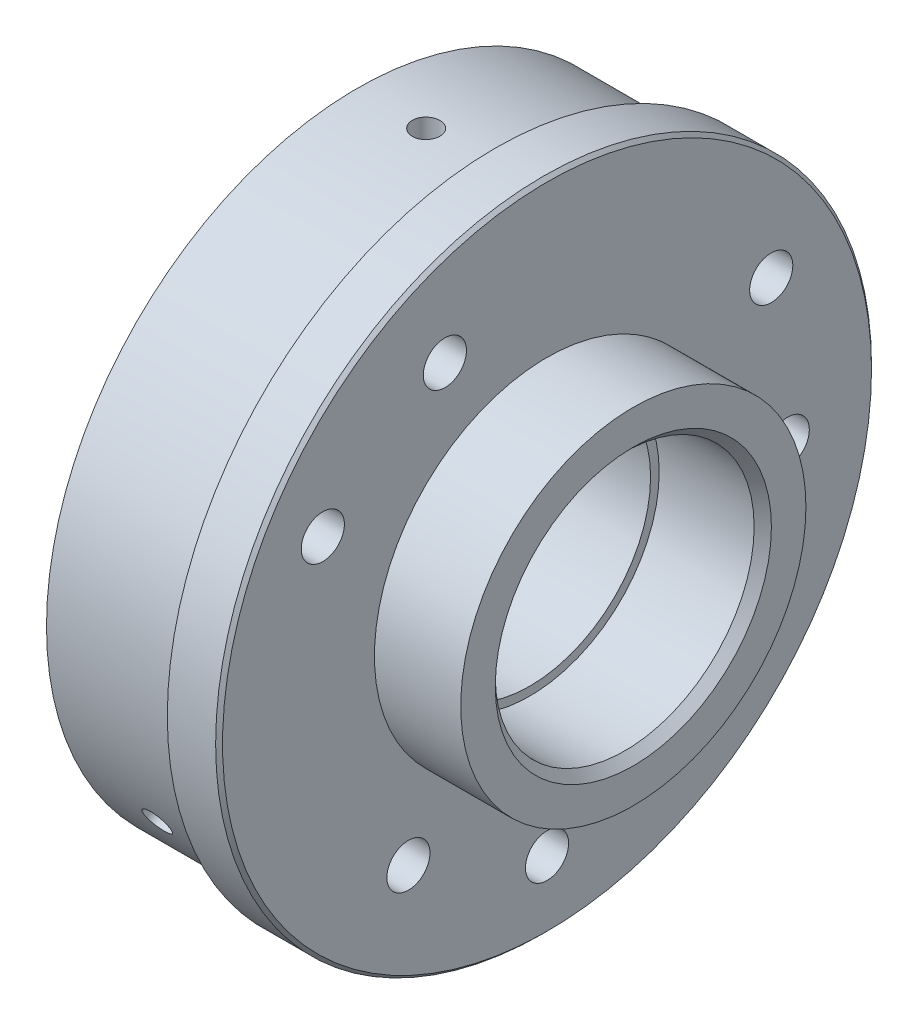
ISO-10303-21;
HEADER;
FILE_DESCRIPTION(('STEP AP214'),'2;1');
FILE_NAME('part.step','',(''),(''),'','','');
FILE_SCHEMA(('AUTOMOTIVE_DESIGN { 1 0 10303 214 1 1 1 1 }'));
ENDSEC;
DATA;
#1=APPLICATION_CONTEXT('core data for automotive mechanical design processes');
#2=APPLICATION_PROTOCOL_DEFINITION('international standard','automotive_design',2000,#1);
#3=PRODUCT_CONTEXT('',#1,'mechanical');
#4=PRODUCT('Part','Part','',(#3));
#5=PRODUCT_RELATED_PRODUCT_CATEGORY('part','',(#4));
#6=PRODUCT_DEFINITION_FORMATION('','',#4);
#7=PRODUCT_DEFINITION_CONTEXT('part definition',#1,'design');
#8=PRODUCT_DEFINITION('design','',#6,#7);
#9=PRODUCT_DEFINITION_SHAPE('','',#8);
#10=(LENGTH_UNIT() NAMED_UNIT(*) SI_UNIT(.MILLI.,.METRE.));
#11=(NAMED_UNIT(*) PLANE_ANGLE_UNIT() SI_UNIT($,.RADIAN.));
#12=(NAMED_UNIT(*) SI_UNIT($,.STERADIAN.) SOLID_ANGLE_UNIT());
#13=UNCERTAINTY_MEASURE_WITH_UNIT(LENGTH_MEASURE(1.E-05),#10,'distance_accuracy_value','');
#14=(GEOMETRIC_REPRESENTATION_CONTEXT(3) GLOBAL_UNCERTAINTY_ASSIGNED_CONTEXT((#13)) GLOBAL_UNIT_ASSIGNED_CONTEXT((#10,
#11,#12)) REPRESENTATION_CONTEXT('',''));
#15=CARTESIAN_POINT('',(0.,0.,0.));
#16=DIRECTION('',(0.,0.,1.));
#17=DIRECTION('',(1.,0.,0.));
#18=AXIS2_PLACEMENT_3D('',#15,#16,#17);
#19=CARTESIAN_POINT('',(-8.,0.,0.));
#20=DIRECTION('',(1.,0.,0.));
#21=DIRECTION('',(0.,0.,-1.));
#22=AXIS2_PLACEMENT_3D('',#19,#20,#21);
#23=CYLINDRICAL_SURFACE('',#22,7.);
#24=CARTESIAN_POINT('',(-8.,0.,0.));
#25=DIRECTION('',(1.,0.,0.));
#26=DIRECTION('',(0.,0.,-1.));
#27=AXIS2_PLACEMENT_3D('',#24,#25,#26);
#28=CIRCLE('',#27,7.);
#29=CARTESIAN_POINT('',(-8.,0.,-7.));
#30=VERTEX_POINT('',#29);
#31=EDGE_CURVE('E122',#30,#30,#28,.T.);
#32=ORIENTED_EDGE('',*,*,#31,.F.);
#33=EDGE_LOOP('',(#32));
#34=FACE_BOUND('',#33,.T.);
#35=CARTESIAN_POINT('',(2.,0.,0.));
#36=DIRECTION('',(1.,0.,0.));
#37=DIRECTION('',(0.,0.,-1.));
#38=AXIS2_PLACEMENT_3D('',#35,#36,#37);
#39=CIRCLE('',#38,7.);
#40=CARTESIAN_POINT('',(2.,0.,-7.));
#41=VERTEX_POINT('',#40);
#42=EDGE_CURVE('E121',#41,#41,#39,.F.);
#43=ORIENTED_EDGE('',*,*,#42,.F.);
#44=EDGE_LOOP('',(#43));
#45=FACE_BOUND('',#44,.T.);
#46=ADVANCED_FACE('F37',(#34,#45),#23,.F.);
#47=CARTESIAN_POINT('',(3.,0.,0.));
#48=DIRECTION('',(-1.,0.,0.));
#49=DIRECTION('',(0.,0.,1.));
#50=AXIS2_PLACEMENT_3D('',#47,#48,#49);
#51=CYLINDRICAL_SURFACE('',#50,19.);
#52=CARTESIAN_POINT('',(2.79999999999999,0.,0.));
#53=DIRECTION('',(1.,0.,0.));
#54=DIRECTION('',(0.,0.,-1.));
#55=AXIS2_PLACEMENT_3D('',#52,#53,#54);
#56=CIRCLE('',#55,19.);
#57=CARTESIAN_POINT('',(2.79999999999999,0.,-19.));
#58=VERTEX_POINT('',#57);
#59=EDGE_CURVE('E11',#58,#58,#56,.F.);
#60=ORIENTED_EDGE('',*,*,#59,.T.);
#61=EDGE_LOOP('',(#60));
#62=FACE_BOUND('',#61,.T.);
#63=CARTESIAN_POINT('',(0.,0.,0.));
#64=DIRECTION('',(1.,0.,0.));
#65=DIRECTION('',(0.,0.,-1.));
#66=AXIS2_PLACEMENT_3D('',#63,#64,#65);
#67=CIRCLE('',#66,19.);
#68=CARTESIAN_POINT('',(0.,0.,-19.));
#69=VERTEX_POINT('',#68);
#70=EDGE_CURVE('E142',#69,#69,#67,.T.);
#71=ORIENTED_EDGE('',*,*,#70,.T.);
#72=EDGE_LOOP('',(#71));
#73=FACE_BOUND('',#72,.T.);
#74=ADVANCED_FACE('F187',(#62,#73),#51,.T.);
#75=CARTESIAN_POINT('',(3.,0.,0.));
#76=DIRECTION('',(1.,0.,0.));
#77=DIRECTION('',(0.,0.,-1.));
#78=AXIS2_PLACEMENT_3D('',#75,#76,#77);
#79=PLANE('',#78);
#80=CARTESIAN_POINT('',(3.,0.,0.));
#81=DIRECTION('',(1.,0.,0.));
#82=DIRECTION('',(0.,0.,-1.));
#83=AXIS2_PLACEMENT_3D('',#80,#81,#82);
#84=CIRCLE('',#83,18.8);
#85=CARTESIAN_POINT('',(3.,0.,-18.8));
#86=VERTEX_POINT('',#85);
#87=EDGE_CURVE('E45',#86,#86,#84,.T.);
#88=ORIENTED_EDGE('',*,*,#87,.T.);
#89=EDGE_LOOP('',(#88));
#90=FACE_BOUND('',#89,.T.);
#91=CARTESIAN_POINT('',(3.,7.49999999999988,12.9903810567666));
#92=DIRECTION('',(1.,0.,0.));
#93=DIRECTION('',(0.,0.,-1.));
#94=AXIS2_PLACEMENT_3D('',#91,#92,#93);
#95=CIRCLE('',#94,1.24999999999999);
#96=CARTESIAN_POINT('',(3.,7.49999999999988,11.7403810567667));
#97=VERTEX_POINT('',#96);
#98=EDGE_CURVE('E84',#97,#97,#95,.T.);
#99=ORIENTED_EDGE('',*,*,#98,.F.);
#100=EDGE_LOOP('',(#99));
#101=FACE_BOUND('',#100,.T.);
#102=CARTESIAN_POINT('',(3.,7.50000000000006,-12.9903810567665));
#103=DIRECTION('',(1.,0.,0.));
#104=DIRECTION('',(0.,0.,-1.));
#105=AXIS2_PLACEMENT_3D('',#102,#103,#104);
#106=CIRCLE('',#105,1.24999999999999);
#107=CARTESIAN_POINT('',(3.,7.50000000000006,-14.2403810567665));
#108=VERTEX_POINT('',#107);
#109=EDGE_CURVE('E83',#108,#108,#106,.T.);
#110=ORIENTED_EDGE('',*,*,#109,.F.);
#111=EDGE_LOOP('',(#110));
#112=FACE_BOUND('',#111,.T.);
#113=CARTESIAN_POINT('',(3.,12.6883090185131,5.91665566436989));
#114=DIRECTION('',(1.,0.,0.));
#115=DIRECTION('',(0.,0.,-1.));
#116=AXIS2_PLACEMENT_3D('',#113,#114,#115);
#117=CIRCLE('',#116,1.25);
#118=CARTESIAN_POINT('',(3.,12.6883090185131,4.66665566436989));
#119=VERTEX_POINT('',#118);
#120=EDGE_CURVE('E94',#119,#119,#117,.T.);
#121=ORIENTED_EDGE('',*,*,#120,.F.);
#122=EDGE_LOOP('',(#121));
#123=FACE_BOUND('',#122,.T.);
#124=CARTESIAN_POINT('',(3.,-1.22018039846717,-13.9467257732844));
#125=DIRECTION('',(1.,0.,0.));
#126=DIRECTION('',(0.,0.,-1.));
#127=AXIS2_PLACEMENT_3D('',#124,#125,#126);
#128=CIRCLE('',#127,1.25);
#129=CARTESIAN_POINT('',(3.,-1.22018039846717,-15.1967257732844));
#130=VERTEX_POINT('',#129);
#131=EDGE_CURVE('E100',#130,#130,#128,.T.);
#132=ORIENTED_EDGE('',*,*,#131,.F.);
#133=EDGE_LOOP('',(#132));
#134=FACE_BOUND('',#133,.T.);
#135=CARTESIAN_POINT('',(3.,-11.4681286200459,8.03007010891466));
#136=DIRECTION('',(1.,0.,0.));
#137=DIRECTION('',(0.,0.,-1.));
#138=AXIS2_PLACEMENT_3D('',#135,#136,#137);
#139=CIRCLE('',#138,1.25);
#140=CARTESIAN_POINT('',(3.,-11.4681286200459,6.78007010891466));
#141=VERTEX_POINT('',#140);
#142=EDGE_CURVE('E106',#141,#141,#139,.T.);
#143=ORIENTED_EDGE('',*,*,#142,.F.);
#144=EDGE_LOOP('',(#143));
#145=FACE_BOUND('',#144,.T.);
#146=CARTESIAN_POINT('',(3.,-15.,0.));
#147=DIRECTION('',(1.,0.,0.));
#148=DIRECTION('',(0.,0.,-1.));
#149=AXIS2_PLACEMENT_3D('',#146,#147,#148);
#150=CIRCLE('',#149,1.24999999999999);
#151=CARTESIAN_POINT('',(3.,-15.,-1.24999999999999));
#152=VERTEX_POINT('',#151);
#153=EDGE_CURVE('E112',#152,#152,#150,.T.);
#154=ORIENTED_EDGE('',*,*,#153,.F.);
#155=EDGE_LOOP('',(#154));
#156=FACE_BOUND('',#155,.T.);
#157=CARTESIAN_POINT('',(3.,0.,0.));
#158=DIRECTION('',(1.,0.,0.));
#159=DIRECTION('',(0.,0.,-1.));
#160=AXIS2_PLACEMENT_3D('',#157,#158,#159);
#161=CIRCLE('',#160,10.);
#162=CARTESIAN_POINT('',(3.,0.,-10.));
#163=VERTEX_POINT('',#162);
#164=EDGE_CURVE('E137',#163,#163,#161,.T.);
#165=ORIENTED_EDGE('',*,*,#164,.F.);
#166=EDGE_LOOP('',(#165));
#167=FACE_BOUND('',#166,.T.);
#168=ADVANCED_FACE('F193',(#90,#101,#112,#123,#134,#145,#156,#167),#79,.T.);
#169=CARTESIAN_POINT('',(0.,0.,0.));
#170=DIRECTION('',(1.,0.,0.));
#171=DIRECTION('',(0.,0.,-1.));
#172=AXIS2_PLACEMENT_3D('',#169,#170,#171);
#173=PLANE('',#172);
#174=CARTESIAN_POINT('',(0.,0.,0.));
#175=DIRECTION('',(-1.,0.,0.));
#176=DIRECTION('',(0.,0.,1.));
#177=AXIS2_PLACEMENT_3D('',#174,#175,#176);
#178=CIRCLE('',#177,18.);
#179=CARTESIAN_POINT('',(0.,0.,18.));
#180=VERTEX_POINT('',#179);
#181=EDGE_CURVE('E138',#180,#180,#178,.T.);
#182=ORIENTED_EDGE('',*,*,#181,.F.);
#183=EDGE_LOOP('',(#182));
#184=FACE_BOUND('',#183,.T.);
#185=ORIENTED_EDGE('',*,*,#70,.F.);
#186=EDGE_LOOP('',(#185));
#187=FACE_BOUND('',#186,.T.);
#188=ADVANCED_FACE('F237',(#184,#187),#173,.F.);
#189=CARTESIAN_POINT('',(8.,0.,0.));
#190=DIRECTION('',(1.,0.,0.));
#191=DIRECTION('',(0.,0.,-1.));
#192=AXIS2_PLACEMENT_3D('',#189,#190,#191);
#193=PLANE('',#192);
#194=CARTESIAN_POINT('',(8.,0.,0.));
#195=DIRECTION('',(1.,0.,0.));
#196=DIRECTION('',(0.,0.,-1.));
#197=AXIS2_PLACEMENT_3D('',#194,#195,#196);
#198=CIRCLE('',#197,8.00000000000001);
#199=CARTESIAN_POINT('',(8.,0.,-8.00000000000001));
#200=VERTEX_POINT('',#199);
#201=EDGE_CURVE('E219',#200,#200,#198,.F.);
#202=ORIENTED_EDGE('',*,*,#201,.T.);
#203=EDGE_LOOP('',(#202));
#204=FACE_BOUND('',#203,.T.);
#205=CARTESIAN_POINT('',(8.,0.,0.));
#206=DIRECTION('',(1.,0.,0.));
#207=DIRECTION('',(0.,0.,-1.));
#208=AXIS2_PLACEMENT_3D('',#205,#206,#207);
#209=CIRCLE('',#208,10.);
#210=CARTESIAN_POINT('',(8.,0.,-10.));
#211=VERTEX_POINT('',#210);
#212=EDGE_CURVE('E143',#211,#211,#209,.T.);
#213=ORIENTED_EDGE('',*,*,#212,.T.);
#214=EDGE_LOOP('',(#213));
#215=FACE_BOUND('',#214,.T.);
#216=ADVANCED_FACE('F239',(#204,#215),#193,.T.);
#217=CARTESIAN_POINT('',(8.,0.,0.));
#218=DIRECTION('',(-1.,0.,0.));
#219=DIRECTION('',(0.,0.,1.));
#220=AXIS2_PLACEMENT_3D('',#217,#218,#219);
#221=CYLINDRICAL_SURFACE('',#220,10.);
#222=ORIENTED_EDGE('',*,*,#212,.F.);
#223=EDGE_LOOP('',(#222));
#224=FACE_BOUND('',#223,.T.);
#225=ORIENTED_EDGE('',*,*,#164,.T.);
#226=EDGE_LOOP('',(#225));
#227=FACE_BOUND('',#226,.T.);
#228=ADVANCED_FACE('F246',(#224,#227),#221,.T.);
#229=CARTESIAN_POINT('',(8.,0.,0.));
#230=DIRECTION('',(-1.,0.,0.));
#231=DIRECTION('',(0.,0.,1.));
#232=AXIS2_PLACEMENT_3D('',#229,#230,#231);
#233=CYLINDRICAL_SURFACE('',#232,7.5);
#234=CARTESIAN_POINT('',(7.5,0.,0.));
#235=DIRECTION('',(1.,0.,0.));
#236=DIRECTION('',(0.,0.,-1.));
#237=AXIS2_PLACEMENT_3D('',#234,#235,#236);
#238=CIRCLE('',#237,7.5);
#239=CARTESIAN_POINT('',(7.5,0.,-7.5));
#240=VERTEX_POINT('',#239);
#241=EDGE_CURVE('E214',#240,#240,#238,.T.);
#242=ORIENTED_EDGE('',*,*,#241,.T.);
#243=EDGE_LOOP('',(#242));
#244=FACE_BOUND('',#243,.T.);
#245=CARTESIAN_POINT('',(2.,0.,0.));
#246=DIRECTION('',(1.,0.,0.));
#247=DIRECTION('',(0.,0.,-1.));
#248=AXIS2_PLACEMENT_3D('',#245,#246,#247);
#249=CIRCLE('',#248,7.5);
#250=CARTESIAN_POINT('',(2.,0.,-7.5));
#251=VERTEX_POINT('',#250);
#252=EDGE_CURVE('E118',#251,#251,#249,.T.);
#253=ORIENTED_EDGE('',*,*,#252,.F.);
#254=EDGE_LOOP('',(#253));
#255=FACE_BOUND('',#254,.T.);
#256=ADVANCED_FACE('F183',(#244,#255),#233,.F.);
#257=CARTESIAN_POINT('',(-8.,0.,0.));
#258=DIRECTION('',(1.,0.,0.));
#259=DIRECTION('',(0.,0.,-1.));
#260=AXIS2_PLACEMENT_3D('',#257,#258,#259);
#261=CYLINDRICAL_SURFACE('',#260,18.);
#262=CARTESIAN_POINT('',(-4.,-8.29828639416792,-15.9730536504567));
#263=CARTESIAN_POINT('',(-4.04491253541467,-8.2982882322285,-15.9730528655544));
#264=CARTESIAN_POINT('',(-4.08985707177756,-8.30165784797817,-15.9713035195612));
#265=CARTESIAN_POINT('',(-4.17850671458254,-8.31504534881652,-15.9643376182597));
#266=CARTESIAN_POINT('',(-4.22221029014034,-8.32507110267378,-15.9591169592152));
#267=CARTESIAN_POINT('',(-4.30708097620846,-8.35146274752712,-15.945321897225));
#268=CARTESIAN_POINT('',(-4.34824935058483,-8.36782544923762,-15.9367491812954));
#269=CARTESIAN_POINT('',(-4.4268922550963,-8.40638982372,-15.9164406429253));
#270=CARTESIAN_POINT('',(-4.4643676639829,-8.42859010278926,-15.9047055754692));
#271=CARTESIAN_POINT('',(-4.5346032301943,-8.47818067013917,-15.8783260928387));
#272=CARTESIAN_POINT('',(-4.56735996428735,-8.50557469326035,-15.8636795836663));
#273=CARTESIAN_POINT('',(-4.62719922470625,-8.56472494929095,-15.8318227804748));
#274=CARTESIAN_POINT('',(-4.65428152128407,-8.5964813587396,-15.8146123826967));
#275=CARTESIAN_POINT('',(-4.70201179883335,-8.66342876402006,-15.7780371192481));
#276=CARTESIAN_POINT('',(-4.7226572293841,-8.69862111400951,-15.7586714037092));
#277=CARTESIAN_POINT('',(-4.75691132402891,-8.77139661502435,-15.7182801727643));
#278=CARTESIAN_POINT('',(-4.77052003315601,-8.80897975074765,-15.6972546679814));
#279=CARTESIAN_POINT('',(-4.79030565936071,-8.88541886694722,-15.6541130463682));
#280=CARTESIAN_POINT('',(-4.79648752764784,-8.92427398166956,-15.631997666369));
#281=CARTESIAN_POINT('',(-4.80125926607071,-9.00216484452729,-15.5872718800287));
#282=CARTESIAN_POINT('',(-4.79984918629879,-9.04120059146915,-15.5646614769546));
#283=CARTESIAN_POINT('',(-4.78948117844713,-9.1183183589471,-15.5196090065169));
#284=CARTESIAN_POINT('',(-4.78052858226978,-9.15640103364507,-15.4971668315344));
#285=CARTESIAN_POINT('',(-4.75533793408356,-9.23057779196064,-15.4530998824533));
#286=CARTESIAN_POINT('',(-4.73909985626299,-9.26667186853233,-15.4314751112509));
#287=CARTESIAN_POINT('',(-4.69979309088659,-9.33589020507949,-15.3896975513685));
#288=CARTESIAN_POINT('',(-4.67672196923644,-9.3690134012687,-15.3695452904267));
#289=CARTESIAN_POINT('',(-4.62440580418913,-9.43137603200504,-15.3313562787175));
#290=CARTESIAN_POINT('',(-4.59516072685771,-9.46061544520409,-15.3133195395787));
#291=CARTESIAN_POINT('',(-4.53129665697614,-9.51444907567132,-15.2799301477883));
#292=CARTESIAN_POINT('',(-4.49667303888851,-9.53903925386473,-15.2645798298482));
#293=CARTESIAN_POINT('',(-4.42305099354048,-9.58288782806628,-15.2370906928517));
#294=CARTESIAN_POINT('',(-4.38405256528788,-9.60214622286516,-15.2249518745238));
#295=CARTESIAN_POINT('',(-4.30278516595046,-9.63482147598638,-15.2042951380698));
#296=CARTESIAN_POINT('',(-4.26051611512937,-9.64823819183838,-15.1957773082548));
#297=CARTESIAN_POINT('',(-4.17390857653039,-9.66887486883717,-15.1826548929634));
#298=CARTESIAN_POINT('',(-4.12957010105683,-9.67609486682327,-15.178050284223));
#299=CARTESIAN_POINT('',(-4.04012294204448,-9.68414426940641,-15.1729157726779));
#300=CARTESIAN_POINT('',(-3.99501494987789,-9.68497913593792,-15.1723823872904));
#301=CARTESIAN_POINT('',(-3.90527350774763,-9.68025070077632,-15.17539963009));
#302=CARTESIAN_POINT('',(-3.86064005654979,-9.67468741572745,-15.178950247653));
#303=CARTESIAN_POINT('',(-3.77313281296976,-9.65731274832734,-15.1900103808884));
#304=CARTESIAN_POINT('',(-3.73025832434384,-9.64550386436991,-15.197518313533));
#305=CARTESIAN_POINT('',(-3.64746462764912,-9.61595055048679,-15.2162347239825));
#306=CARTESIAN_POINT('',(-3.60754543303909,-9.59820609353179,-15.2274432186388));
#307=CARTESIAN_POINT('',(-3.53176569709678,-9.55723608445839,-15.2531905504107));
#308=CARTESIAN_POINT('',(-3.49590793446623,-9.53400681292419,-15.2677316472656));
#309=CARTESIAN_POINT('',(-3.42929687026348,-9.48269065920017,-15.2996564854373));
#310=CARTESIAN_POINT('',(-3.39854359488202,-9.45460375208772,-15.3170402413388));
#311=CARTESIAN_POINT('',(-3.34299277681805,-9.3943033341771,-15.3540976842522));
#312=CARTESIAN_POINT('',(-3.31819941168787,-9.36208695296799,-15.3737729632316));
#313=CARTESIAN_POINT('',(-3.27530076043778,-9.29441683268542,-15.4147779363577));
#314=CARTESIAN_POINT('',(-3.25719544978789,-9.25896310548627,-15.4361076244361));
#315=CARTESIAN_POINT('',(-3.22819416715811,-9.18580665916933,-15.4797534881095));
#316=CARTESIAN_POINT('',(-3.21729551178395,-9.14810478285574,-15.5020692932187));
#317=CARTESIAN_POINT('',(-3.20300812195765,-9.07149129348421,-15.5470260046335));
#318=CARTESIAN_POINT('',(-3.19961935687924,-9.03257968536037,-15.5696669096129));
#319=CARTESIAN_POINT('',(-3.20044825055121,-8.95468085666145,-15.6145992865762));
#320=CARTESIAN_POINT('',(-3.20465934947746,-8.9156937302826,-15.636891043177));
#321=CARTESIAN_POINT('',(-3.22055489093794,-8.83872513941824,-15.6805260054766));
#322=CARTESIAN_POINT('',(-3.23223934782558,-8.80074367686435,-15.7018692093537));
#323=CARTESIAN_POINT('',(-3.26274866370429,-8.72688452896763,-15.743038955215));
#324=CARTESIAN_POINT('',(-3.28157360300715,-8.6910068672923,-15.7628654801376));
#325=CARTESIAN_POINT('',(-3.32582820454483,-8.6224048192452,-15.8004958074915));
#326=CARTESIAN_POINT('',(-3.35125765223204,-8.58968033048987,-15.8182996756019));
#327=CARTESIAN_POINT('',(-3.40802229373744,-8.5283247908287,-15.8514635169255));
#328=CARTESIAN_POINT('',(-3.43936193104228,-8.49969684851762,-15.8668216352101));
#329=CARTESIAN_POINT('',(-3.50705684642232,-8.44741044820436,-15.8947204286585));
#330=CARTESIAN_POINT('',(-3.54341335917541,-8.4237532171455,-15.9072604082613));
#331=CARTESIAN_POINT('',(-3.62013384767306,-8.38211180670054,-15.9292422389183));
#332=CARTESIAN_POINT('',(-3.66050122984899,-8.36413250466646,-15.9386814266644));
#333=CARTESIAN_POINT('',(-3.74404272013064,-8.33443736161026,-15.9542294538324));
#334=CARTESIAN_POINT('',(-3.78721343416512,-8.32271409916667,-15.9603422394728));
#335=CARTESIAN_POINT('',(-3.85887821776945,-8.30897393315468,-15.967497783782));
#336=CARTESIAN_POINT('',(-3.88690776818531,-8.30497150970643,-15.9695791254164));
#337=CARTESIAN_POINT('',(-3.9432872918259,-8.29962716072342,-15.9723573061289));
#338=CARTESIAN_POINT('',(-3.97163726483683,-8.29828523341346,-15.9730541461307));
#339=CARTESIAN_POINT('',(-4.,-8.29828639416792,-15.9730536504567));
#340=B_SPLINE_CURVE_WITH_KNOTS('',3,(#262,#263,#264,#265,#266,#267,#268,#269,#270,#271,#272,
#273,#274,#275,#276,#277,#278,#279,#280,#281,#282,#283,#284,#285,#286,#287,#288,#289,#290,#291,
#292,#293,#294,#295,#296,#297,#298,#299,#300,#301,#302,#303,#304,#305,#306,#307,#308,#309,#310,
#311,#312,#313,#314,#315,#316,#317,#318,#319,#320,#321,#322,#323,#324,#325,#326,#327,#328,#329,
#330,#331,#332,#333,#334,#335,#336,#337,#338,#339),.UNSPECIFIED.,.T.,.F.,(4,2,2,2,2,2,2,2,2,2,2,
2,2,2,2,2,2,2,2,2,2,2,2,2,2,2,2,2,2,2,2,2,2,2,2,2,2,2,4),(0.,0.134634073743632,
0.269427593593184,0.40415336197232,0.538846994170594,0.673637854972982,0.808434172166958,
0.943283830800823,1.07813262642393,1.21289147319659,1.34764943081977,1.48231220615442,
1.61697545858912,1.75168673912334,1.88639876009761,2.02122728122655,2.15605583293478,
2.29088767273765,2.4257187109635,2.56043439984086,2.69514973826737,2.82981122794488,
2.96447333084953,3.09922701573345,3.23398139200638,3.36882994966196,3.50367801272475,
3.63847583686628,3.77327311128448,3.90795409105029,4.04263532948657,4.17731808278013,
4.31199646144824,4.44677650263756,4.58158977321782,4.71651853563243,4.8512868767709,
4.93630975713668,5.02133258077096),.UNSPECIFIED.);
#341=CARTESIAN_POINT('',(-4.,-8.29828639416792,-15.9730536504567));
#342=VERTEX_POINT('',#341);
#343=EDGE_CURVE('E208',#342,#342,#340,.T.);
#344=ORIENTED_EDGE('',*,*,#343,.T.);
#345=EDGE_LOOP('',(#344));
#346=FACE_BOUND('',#345,.T.);
#347=CARTESIAN_POINT('',(-4.,-9.68392704022322,15.1730536504566));
#348=CARTESIAN_POINT('',(-4.04491253541467,-9.68392544144758,15.1730548498126));
#349=CARTESIAN_POINT('',(-4.08985707177756,-9.68072565550268,15.1750983496562));
#350=CARTESIAN_POINT('',(-4.17850671458254,-9.66799925759609,15.1832093148246));
#351=CARTESIAN_POINT('',(-4.22221029014034,-9.65846515731049,15.1892815428349));
#352=CARTESIAN_POINT('',(-4.30708097620846,-9.63332246075347,15.2052398467304));
#353=CARTESIAN_POINT('',(-4.34824935058483,-9.61771692012383,15.2151240041215));
#354=CARTESIAN_POINT('',(-4.42689225509629,-9.58084702274033,15.2383674629192));
#355=CARTESIAN_POINT('',(-4.4643676639829,-9.55958401667361,15.2517259348362));
#356=CARTESIAN_POINT('',(-4.5346032301943,-9.51194343090195,15.2814828846341));
#357=CARTESIAN_POINT('',(-4.56735996428735,-9.48556217032128,15.2978835499827));
#358=CARTESIAN_POINT('',(-4.62719922470625,-9.42839824145882,15.3331807727498));
#359=CARTESIAN_POINT('',(-4.65428152128407,-9.3976153950494,15.3520774311762));
#360=CARTESIAN_POINT('',(-4.70201179883335,-9.33246658511261,15.3917679531423));
#361=CARTESIAN_POINT('',(-4.7226572293841,-9.29809920849874,15.4125625644826));
#362=CARTESIAN_POINT('',(-4.7569113240289,-9.22673162590289,15.4553923816621));
#363=CARTESIAN_POINT('',(-4.77052003315601,-9.18973143677189,15.4774275795609));
#364=CARTESIAN_POINT('',(-4.79030565936071,-9.11415013839456,15.522054985226));
#365=CARTESIAN_POINT('',(-4.79648752764784,-9.07557010013979,15.5446468116429));
#366=CARTESIAN_POINT('',(-4.80125926607071,-8.99789100153593,15.5897393844302));
#367=CARTESIAN_POINT('',(-4.79984918629879,-8.95879194461306,15.6122401314005));
#368=CARTESIAN_POINT('',(-4.78948117844713,-8.88121647697181,15.6564998419007));
#369=CARTESIAN_POINT('',(-4.78052858226978,-8.84273964597181,15.678259318142));
#370=CARTESIAN_POINT('',(-4.75533793408356,-8.76748816944248,15.7204648006731));
#371=CARTESIAN_POINT('',(-4.73909985626299,-8.73071352994435,15.7409108023091));
#372=CARTESIAN_POINT('',(-4.69979309088659,-8.65992393350449,15.7799668602254));
#373=CARTESIAN_POINT('',(-4.67672196923644,-8.62590996549056,15.7985762591089));
#374=CARTESIAN_POINT('',(-4.62440580418913,-8.56165599583684,15.8334893757188));
#375=CARTESIAN_POINT('',(-4.59516072685771,-8.53141601494166,15.8497930807716));
#376=CARTESIAN_POINT('',(-4.53129665697614,-8.47558313820064,15.8797196764389));
#377=CARTESIAN_POINT('',(-4.49667303888851,-8.44999428381162,15.8933402364679));
#378=CARTESIAN_POINT('',(-4.42305099354048,-8.4042637057438,15.917569647148));
#379=CARTESIAN_POINT('',(-4.38405256528788,-8.38412198330042,15.9281784971159));
#380=CARTESIAN_POINT('',(-4.30278516595046,-8.34989509821145,15.946147728167));
#381=CARTESIAN_POINT('',(-4.26051611512937,-8.33581008328053,15.9535080300227));
#382=CARTESIAN_POINT('',(-4.17390857653039,-8.31412739977973,15.9648187089076));
#383=CARTESIAN_POINT('',(-4.12957010105683,-8.30652969264299,15.9687691062087));
#384=CARTESIAN_POINT('',(-4.04012294204448,-8.29805837391742,15.9731728375585));
#385=CARTESIAN_POINT('',(-3.99501494987789,-8.297179015356,15.9736291604897));
#386=CARTESIAN_POINT('',(-3.90527350774763,-8.30215624185065,15.9710428369194));
#387=CARTESIAN_POINT('',(-3.86064005654979,-8.30801280938375,15.9680001995201));
#388=CARTESIAN_POINT('',(-3.77313281296977,-8.32627849943498,15.958483362787));
#389=CARTESIAN_POINT('',(-3.73025832434384,-8.33868500181383,15.9520105356119));
#390=CARTESIAN_POINT('',(-3.64746462764912,-8.36967054567224,15.9357748202478));
#391=CARTESIAN_POINT('',(-3.60754543303909,-8.38824961526033,15.9260119170766));
#392=CARTESIAN_POINT('',(-3.53176569709678,-8.43103246319115,15.9034045143117));
#393=CARTESIAN_POINT('',(-3.49590793446622,-8.45524005823344,15.8905579234791));
#394=CARTESIAN_POINT('',(-3.42929687026348,-8.50854585596392,15.8620792498155));
#395=CARTESIAN_POINT('',(-3.39854359488201,-8.53764408374402,15.8464471526931));
#396=CARTESIAN_POINT('',(-3.34299277681805,-8.59988697966156,15.8127541803803));
#397=CARTESIAN_POINT('',(-3.31819941168787,-8.63303446168887,15.794691615325));
#398=CARTESIAN_POINT('',(-3.27530076043778,-8.70238087023888,15.7565900586462));
#399=CARTESIAN_POINT('',(-3.25719544978789,-8.73857978556916,15.7365510742721));
#400=CARTESIAN_POINT('',(-3.22819416715811,-8.8129564354389,15.6950186651477));
#401=CARTESIAN_POINT('',(-3.21729551178395,-8.85113342772612,15.6735257850444));
#402=CARTESIAN_POINT('',(-3.20300812195765,-8.9283738265677,15.6296549126835));
#403=CARTESIAN_POINT('',(-3.19961935687924,-8.96743722950651,15.6072769240358));
#404=CARTESIAN_POINT('',(-3.20044825055121,-9.04529922375858,15.5622807479392));
#405=CARTESIAN_POINT('',(-3.20465934947746,-9.08409801445923,15.5396627843749));
#406=CARTESIAN_POINT('',(-3.22055489093794,-9.1603712957361,15.4948235105427));
#407=CARTESIAN_POINT('',(-3.23223934782558,-9.19784578376871,15.4726022010367));
#408=CARTESIAN_POINT('',(-3.26274866370429,-9.27042940350034,15.4292231755869));
#409=CARTESIAN_POINT('',(-3.28157360300715,-9.30553850858975,15.408065471609));
#410=CARTESIAN_POINT('',(-3.32582820454483,-9.37242835205452,15.3674695189255));
#411=CARTESIAN_POINT('',(-3.35125765223204,-9.4042091985014,15.3480312143927));
#412=CARTESIAN_POINT('',(-3.40802229373744,-9.46360769740532,15.3114776790451));
#413=CARTESIAN_POINT('',(-3.43936193104228,-9.49122218914958,15.2943642128879));
#414=CARTESIAN_POINT('',(-3.50705684642232,-9.54152645316747,15.2630322586683));
#415=CARTESIAN_POINT('',(-3.54341335917541,-9.56421500959592,15.2488144853896));
#416=CARTESIAN_POINT('',(-3.62013384767306,-9.60407253858899,15.2237428814233));
#417=CARTESIAN_POINT('',(-3.66050122984899,-9.6212367659853,15.2128919429926));
#418=CARTESIAN_POINT('',(-3.74404272013065,-9.64954932401958,15.1949492083209));
#419=CARTESIAN_POINT('',(-3.78721343416512,-9.66070478289383,15.1878529580497));
#420=CARTESIAN_POINT('',(-3.85887821776945,-9.67377174904955,15.1795313973857));
#421=CARTESIAN_POINT('',(-3.88690776818531,-9.67757545550302,15.17710586782));
#422=CARTESIAN_POINT('',(-3.9432872918259,-9.68265360506779,15.1738666161903));
#423=CARTESIAN_POINT('',(-3.97163726483683,-9.68392804986673,15.1730528930507));
#424=CARTESIAN_POINT('',(-4.,-9.68392704022322,15.1730536504566));
#425=B_SPLINE_CURVE_WITH_KNOTS('',3,(#347,#348,#349,#350,#351,#352,#353,#354,#355,#356,#357,
#358,#359,#360,#361,#362,#363,#364,#365,#366,#367,#368,#369,#370,#371,#372,#373,#374,#375,#376,
#377,#378,#379,#380,#381,#382,#383,#384,#385,#386,#387,#388,#389,#390,#391,#392,#393,#394,#395,
#396,#397,#398,#399,#400,#401,#402,#403,#404,#405,#406,#407,#408,#409,#410,#411,#412,#413,#414,
#415,#416,#417,#418,#419,#420,#421,#422,#423,#424),.UNSPECIFIED.,.T.,.F.,(4,2,2,2,2,2,2,2,2,2,2,
2,2,2,2,2,2,2,2,2,2,2,2,2,2,2,2,2,2,2,2,2,2,2,2,2,2,2,4),(0.,0.134634073743633,
0.269427593593184,0.404153361972318,0.538846994170593,0.673637854972982,0.808434172166957,
0.943283830800822,1.07813262642393,1.21289147319659,1.34764943081977,1.48231220615442,
1.61697545858912,1.75168673912334,1.88639876009761,2.02122728122655,2.15605583293478,
2.29088767273765,2.4257187109635,2.56043439984086,2.69514973826736,2.82981122794488,
2.96447333084953,3.09922701573345,3.23398139200638,3.36882994966196,3.50367801272474,
3.63847583686627,3.77327311128447,3.90795409105029,4.04263532948657,4.17731808278012,
4.31199646144823,4.44677650263755,4.58158977321782,4.71651853563243,4.8512868767709,
4.93630975713667,5.02133258077096),.UNSPECIFIED.);
#426=CARTESIAN_POINT('',(-4.,-9.68392704022322,15.1730536504566));
#427=VERTEX_POINT('',#426);
#428=EDGE_CURVE('E157',#427,#427,#425,.T.);
#429=ORIENTED_EDGE('',*,*,#428,.T.);
#430=EDGE_LOOP('',(#429));
#431=FACE_BOUND('',#430,.T.);
#432=CARTESIAN_POINT('',(-4.,17.9822134343912,0.799999999999989));
#433=CARTESIAN_POINT('',(-4.04491253541467,17.9822136736761,0.799998015741671));
#434=CARTESIAN_POINT('',(-4.08985707177756,17.9823835034809,0.796205169904897));
#435=CARTESIAN_POINT('',(-4.17850671458254,17.9830446064127,0.781128303434914));
#436=CARTESIAN_POINT('',(-4.22221029014034,17.9835362599843,0.769835416380222));
#437=CARTESIAN_POINT('',(-4.30708097620846,17.9847852082807,0.740082050494442));
#438=CARTESIAN_POINT('',(-4.34824935058483,17.9855423693615,0.721625177173847));
#439=CARTESIAN_POINT('',(-4.42689225509629,17.9872368464604,0.678073180005957));
#440=CARTESIAN_POINT('',(-4.4643676639829,17.9881741194629,0.652979640632829));
#441=CARTESIAN_POINT('',(-4.5346032301943,17.9901241010412,0.596843208204473));
#442=CARTESIAN_POINT('',(-4.56735996428735,17.9911368635817,0.565796033683465));
#443=CARTESIAN_POINT('',(-4.62719922470625,17.9931231907498,0.498642007724883));
#444=CARTESIAN_POINT('',(-4.65428152128407,17.9940967537891,0.462534951520304));
#445=CARTESIAN_POINT('',(-4.70201179883335,17.9958953491327,0.386269166105694));
#446=CARTESIAN_POINT('',(-4.7226572293841,17.9967203225083,0.346108839226518));
#447=CARTESIAN_POINT('',(-4.75691132402891,17.9981282409273,0.262887791102066));
#448=CARTESIAN_POINT('',(-4.77052003315601,17.9987111875196,0.219827088420375));
#449=CARTESIAN_POINT('',(-4.79030565936071,17.9995690053419,0.132058061142083));
#450=CARTESIAN_POINT('',(-4.79648752764784,17.9998440818094,0.0873508547260085));
#451=CARTESIAN_POINT('',(-4.80125926607071,18.0000558460633,-0.00246750440166175));
#452=CARTESIAN_POINT('',(-4.79984918629879,17.9999925360823,-0.0475786544460418));
#453=CARTESIAN_POINT('',(-4.78948117844713,17.999534835919,-0.136890835383924));
#454=CARTESIAN_POINT('',(-4.78052858226978,17.999140679617,-0.181092486607676));
#455=CARTESIAN_POINT('',(-4.75533793408356,17.9980659614032,-0.26736491821991));
#456=CARTESIAN_POINT('',(-4.73909985626299,17.9973853984768,-0.309435691058322));
#457=CARTESIAN_POINT('',(-4.69979309088659,17.995814138584,-0.390269308857058));
#458=CARTESIAN_POINT('',(-4.67672196923644,17.9949233667593,-0.429030968682368));
#459=CARTESIAN_POINT('',(-4.62440580418913,17.9930320278419,-0.502133097001445));
#460=CARTESIAN_POINT('',(-4.59516072685771,17.9920314601458,-0.536473541192979));
#461=CARTESIAN_POINT('',(-4.53129665697614,17.990032213872,-0.599789528650753));
#462=CARTESIAN_POINT('',(-4.49667303888851,17.9890335376764,-0.628760406619898));
#463=CARTESIAN_POINT('',(-4.42305099354048,17.9871515338101,-0.680478954296393));
#464=CARTESIAN_POINT('',(-4.38405256528788,17.9862682061657,-0.703226622592311));
#465=CARTESIAN_POINT('',(-4.30278516595046,17.9847165741979,-0.741852590097329));
#466=CARTESIAN_POINT('',(-4.26051611512936,17.984048275119,-0.75773072176803));
#467=CARTESIAN_POINT('',(-4.17390857653039,17.983002268617,-0.7821638159444));
#468=CARTESIAN_POINT('',(-4.12957010105683,17.9826245594663,-0.790718821985843));
#469=CARTESIAN_POINT('',(-4.04012294204448,17.9822026433239,-0.800257064880635));
#470=CARTESIAN_POINT('',(-3.99501494987789,17.982158151294,-0.801246773199489));
#471=CARTESIAN_POINT('',(-3.90527350774763,17.982406942627,-0.79564320682959));
#472=CARTESIAN_POINT('',(-3.86064005654979,17.9827002251113,-0.789049951867286));
#473=CARTESIAN_POINT('',(-3.77313281296976,17.9835912477624,-0.768472981898739));
#474=CARTESIAN_POINT('',(-3.73025832434384,17.9841888661838,-0.754492222078961));
#475=CARTESIAN_POINT('',(-3.64746462764912,17.9856210961591,-0.719540096265447));
#476=CARTESIAN_POINT('',(-3.60754543303909,17.9864557087922,-0.698568698437886));
#477=CARTESIAN_POINT('',(-3.53176569709678,17.9882685476496,-0.650213963901096));
#478=CARTESIAN_POINT('',(-3.49590793446622,17.9892468711577,-0.622826276213648));
#479=CARTESIAN_POINT('',(-3.42929687026348,17.9912365151642,-0.562422764378247));
#480=CARTESIAN_POINT('',(-3.39854359488201,17.9922478358318,-0.529406911354389));
#481=CARTESIAN_POINT('',(-3.34299277681805,17.9941903138387,-0.458656496128309));
#482=CARTESIAN_POINT('',(-3.31819941168787,17.9951214146569,-0.420918652093493));
#483=CARTESIAN_POINT('',(-3.27530076043778,17.9967977029244,-0.341812122288578));
#484=CARTESIAN_POINT('',(-3.25719544978789,17.9975428910555,-0.300443449836062));
#485=CARTESIAN_POINT('',(-3.22819416715811,17.9987630946083,-0.215265177038298));
#486=CARTESIAN_POINT('',(-3.21729551178395,17.9992382105819,-0.171456491825817));
#487=CARTESIAN_POINT('',(-3.20300812195765,17.999865120052,-0.0826289080501089));
#488=CARTESIAN_POINT('',(-3.19961935687924,18.000016914867,-0.03761001442302));
#489=CARTESIAN_POINT('',(-3.20044825055121,17.9999800804201,0.052318538636928));
#490=CARTESIAN_POINT('',(-3.20465934947746,17.9997917447419,0.0972282588019375));
#491=CARTESIAN_POINT('',(-3.22055489093794,17.9990964351544,0.185702494933803));
#492=CARTESIAN_POINT('',(-3.23223934782558,17.9985894606331,0.229267008316873));
#493=CARTESIAN_POINT('',(-3.26274866370429,17.997313932468,0.313815779627975));
#494=CARTESIAN_POINT('',(-3.28157360300715,17.9965453758821,0.354800008528497));
#495=CARTESIAN_POINT('',(-3.32582820454483,17.9948331712998,0.433026288565886));
#496=CARTESIAN_POINT('',(-3.35125765223204,17.9938895289913,0.470268461209049));
#497=CARTESIAN_POINT('',(-3.40802229373744,17.9919324882341,0.539985837880336));
#498=CARTESIAN_POINT('',(-3.43936193104228,17.9909190376673,0.572457422322073));
#499=CARTESIAN_POINT('',(-3.50705684642232,17.9889369013719,0.631688169990006));
#500=CARTESIAN_POINT('',(-3.54341335917541,17.9879682267415,0.658445922871604));
#501=CARTESIAN_POINT('',(-3.62013384767306,17.9861843452896,0.705499357494824));
#502=CARTESIAN_POINT('',(-3.66050122984899,17.9853692706518,0.725789483671729));
#503=CARTESIAN_POINT('',(-3.74404272013065,17.9839866856299,0.759280245511391));
#504=CARTESIAN_POINT('',(-3.78721343416512,17.9834188820606,0.772489281422961));
#505=CARTESIAN_POINT('',(-3.85887821776945,17.9827456822043,0.787966386396189));
#506=CARTESIAN_POINT('',(-3.88690776818531,17.9825469652095,0.792473257596281));
#507=CARTESIAN_POINT('',(-3.9432872918259,17.9822807657913,0.798490689938464));
#508=CARTESIAN_POINT('',(-3.97163726483683,17.9822132832803,0.80000125307984));
#509=CARTESIAN_POINT('',(-4.,17.9822134343912,0.799999999999989));
#510=B_SPLINE_CURVE_WITH_KNOTS('',3,(#432,#433,#434,#435,#436,#437,#438,#439,#440,#441,#442,
#443,#444,#445,#446,#447,#448,#449,#450,#451,#452,#453,#454,#455,#456,#457,#458,#459,#460,#461,
#462,#463,#464,#465,#466,#467,#468,#469,#470,#471,#472,#473,#474,#475,#476,#477,#478,#479,#480,
#481,#482,#483,#484,#485,#486,#487,#488,#489,#490,#491,#492,#493,#494,#495,#496,#497,#498,#499,
#500,#501,#502,#503,#504,#505,#506,#507,#508,#509),.UNSPECIFIED.,.T.,.F.,(4,2,2,2,2,2,2,2,2,2,2,
2,2,2,2,2,2,2,2,2,2,2,2,2,2,2,2,2,2,2,2,2,2,2,2,2,2,2,4),(0.,0.134634073743633,
0.269427593593184,0.40415336197232,0.538846994170593,0.673637854972983,0.808434172166958,
0.943283830800823,1.07813262642394,1.21289147319659,1.34764943081977,1.48231220615442,
1.61697545858912,1.75168673912334,1.88639876009761,2.02122728122655,2.15605583293478,
2.29088767273765,2.4257187109635,2.56043439984086,2.69514973826736,2.82981122794488,
2.96447333084953,3.09922701573345,3.23398139200638,3.36882994966196,3.50367801272474,
3.63847583686628,3.77327311128448,3.90795409105029,4.04263532948657,4.17731808278012,
4.31199646144823,4.44677650263755,4.58158977321782,4.71651853563243,4.8512868767709,
4.93630975713667,5.02133258077096),.UNSPECIFIED.);
#511=CARTESIAN_POINT('',(-4.,17.9822134343912,0.799999999999989));
#512=VERTEX_POINT('',#511);
#513=EDGE_CURVE('E141',#512,#512,#510,.T.);
#514=ORIENTED_EDGE('',*,*,#513,.T.);
#515=EDGE_LOOP('',(#514));
#516=FACE_BOUND('',#515,.T.);
#517=CARTESIAN_POINT('',(-8.,0.,0.));
#518=DIRECTION('',(-1.,0.,0.));
#519=DIRECTION('',(0.,0.,1.));
#520=AXIS2_PLACEMENT_3D('',#517,#518,#519);
#521=CIRCLE('',#520,18.);
#522=CARTESIAN_POINT('',(-8.,0.,18.));
#523=VERTEX_POINT('',#522);
#524=EDGE_CURVE('E134',#523,#523,#521,.T.);
#525=ORIENTED_EDGE('',*,*,#524,.F.);
#526=EDGE_LOOP('',(#525));
#527=FACE_BOUND('',#526,.T.);
#528=ORIENTED_EDGE('',*,*,#181,.T.);
#529=EDGE_LOOP('',(#528));
#530=FACE_BOUND('',#529,.T.);
#531=ADVANCED_FACE('F163',(#346,#431,#516,#527,#530),#261,.T.);
#532=CARTESIAN_POINT('',(-8.,0.,0.));
#533=DIRECTION('',(-1.,0.,0.));
#534=DIRECTION('',(0.,0.,1.));
#535=AXIS2_PLACEMENT_3D('',#532,#533,#534);
#536=PLANE('',#535);
#537=ORIENTED_EDGE('',*,*,#31,.T.);
#538=EDGE_LOOP('',(#537));
#539=FACE_BOUND('',#538,.T.);
#540=ORIENTED_EDGE('',*,*,#524,.T.);
#541=EDGE_LOOP('',(#540));
#542=FACE_BOUND('',#541,.T.);
#543=ADVANCED_FACE('F173',(#539,#542),#536,.T.);
#544=CARTESIAN_POINT('',(-4.,18.,0.));
#545=DIRECTION('',(0.,1.,0.));
#546=DIRECTION('',(0.,0.,1.));
#547=AXIS2_PLACEMENT_3D('',#544,#545,#546);
#548=CYLINDRICAL_SURFACE('',#547,0.799999999999989);
#549=CARTESIAN_POINT('',(-4.,12.8,0.));
#550=DIRECTION('',(0.,1.,0.));
#551=DIRECTION('',(0.,0.,1.));
#552=AXIS2_PLACEMENT_3D('',#549,#550,#551);
#553=CIRCLE('',#552,0.799999999999988);
#554=CARTESIAN_POINT('',(-4.,12.8,0.799999999999988));
#555=VERTEX_POINT('',#554);
#556=EDGE_CURVE('E131',#555,#555,#553,.T.);
#557=ORIENTED_EDGE('',*,*,#556,.F.);
#558=EDGE_LOOP('',(#557));
#559=FACE_BOUND('',#558,.T.);
#560=ORIENTED_EDGE('',*,*,#513,.F.);
#561=EDGE_LOOP('',(#560));
#562=FACE_BOUND('',#561,.T.);
#563=ADVANCED_FACE('F167',(#559,#562),#548,.F.);
#564=CARTESIAN_POINT('',(-4.,12.8,0.));
#565=DIRECTION('',(0.,1.,0.));
#566=DIRECTION('',(0.,0.,1.));
#567=AXIS2_PLACEMENT_3D('',#564,#565,#566);
#568=CONICAL_SURFACE('',#567,0.799999999999988,1.02974425867664);
#569=CARTESIAN_POINT('',(-4.,12.3193115047779,0.));
#570=VERTEX_POINT('',#569);
#571=VERTEX_LOOP('',#570);
#572=FACE_BOUND('',#571,.T.);
#573=ORIENTED_EDGE('',*,*,#556,.T.);
#574=EDGE_LOOP('',(#573));
#575=FACE_BOUND('',#574,.T.);
#576=ADVANCED_FACE('F172',(#572,#575),#568,.F.);
#577=CARTESIAN_POINT('',(-4.,-9.00000000000007,15.5884572681199));
#578=DIRECTION('',(0.,-0.500000000000004,0.866025403784436));
#579=DIRECTION('',(0.,-0.866025403784436,-0.500000000000004));
#580=AXIS2_PLACEMENT_3D('',#577,#578,#579);
#581=CYLINDRICAL_SURFACE('',#580,0.799999999999989);
#582=CARTESIAN_POINT('',(-4.,-6.40000000000005,11.0851251684408));
#583=DIRECTION('',(0.,-0.500000000000004,0.866025403784436));
#584=DIRECTION('',(0.,-0.866025403784436,-0.500000000000004));
#585=AXIS2_PLACEMENT_3D('',#582,#583,#584);
#586=CIRCLE('',#585,0.799999999999988);
#587=CARTESIAN_POINT('',(-4.,-7.09282032302759,10.6851251684408));
#588=VERTEX_POINT('',#587);
#589=EDGE_CURVE('E128',#588,#588,#586,.T.);
#590=ORIENTED_EDGE('',*,*,#589,.F.);
#591=EDGE_LOOP('',(#590));
#592=FACE_BOUND('',#591,.T.);
#593=ORIENTED_EDGE('',*,*,#428,.F.);
#594=EDGE_LOOP('',(#593));
#595=FACE_BOUND('',#594,.T.);
#596=ADVANCED_FACE('F177',(#592,#595),#581,.F.);
#597=CARTESIAN_POINT('',(-4.,-6.40000000000005,11.0851251684408));
#598=DIRECTION('',(0.,-0.500000000000004,0.866025403784436));
#599=DIRECTION('',(0.,-0.866025403784436,-0.500000000000004));
#600=AXIS2_PLACEMENT_3D('',#597,#598,#599);
#601=CONICAL_SURFACE('',#600,0.799999999999988,1.02974425867664);
#602=CARTESIAN_POINT('',(-4.,-6.15965575238902,10.6688367202716));
#603=VERTEX_POINT('',#602);
#604=VERTEX_LOOP('',#603);
#605=FACE_BOUND('',#604,.T.);
#606=ORIENTED_EDGE('',*,*,#589,.T.);
#607=EDGE_LOOP('',(#606));
#608=FACE_BOUND('',#607,.T.);
#609=ADVANCED_FACE('F175',(#605,#608),#601,.F.);
#610=CARTESIAN_POINT('',(-4.,-8.99999999999985,-15.58845726812));
#611=DIRECTION('',(0.,-0.499999999999992,-0.866025403784443));
#612=DIRECTION('',(0.,0.866025403784443,-0.499999999999992));
#613=AXIS2_PLACEMENT_3D('',#610,#611,#612);
#614=CYLINDRICAL_SURFACE('',#613,0.799999999999989);
#615=CARTESIAN_POINT('',(-4.,-6.3999999999999,-11.0851251684409));
#616=DIRECTION('',(0.,-0.499999999999992,-0.866025403784443));
#617=DIRECTION('',(0.,0.866025403784443,-0.499999999999992));
#618=AXIS2_PLACEMENT_3D('',#615,#616,#617);
#619=CIRCLE('',#618,0.799999999999988);
#620=CARTESIAN_POINT('',(-4.,-5.70717967697235,-11.4851251684409));
#621=VERTEX_POINT('',#620);
#622=EDGE_CURVE('E125',#621,#621,#619,.T.);
#623=ORIENTED_EDGE('',*,*,#622,.F.);
#624=EDGE_LOOP('',(#623));
#625=FACE_BOUND('',#624,.T.);
#626=ORIENTED_EDGE('',*,*,#343,.F.);
#627=EDGE_LOOP('',(#626));
#628=FACE_BOUND('',#627,.T.);
#629=ADVANCED_FACE('F202',(#625,#628),#614,.F.);
#630=CARTESIAN_POINT('',(-4.,-6.3999999999999,-11.0851251684409));
#631=DIRECTION('',(0.,-0.499999999999992,-0.866025403784443));
#632=DIRECTION('',(0.,0.866025403784443,-0.499999999999992));
#633=AXIS2_PLACEMENT_3D('',#630,#631,#632);
#634=CONICAL_SURFACE('',#633,0.799999999999988,1.02974425867664);
#635=CARTESIAN_POINT('',(-4.,-6.15965575238887,-10.6688367202717));
#636=VERTEX_POINT('',#635);
#637=VERTEX_LOOP('',#636);
#638=FACE_BOUND('',#637,.T.);
#639=ORIENTED_EDGE('',*,*,#622,.T.);
#640=EDGE_LOOP('',(#639));
#641=FACE_BOUND('',#640,.T.);
#642=ADVANCED_FACE('F206',(#638,#641),#634,.F.);
#643=CARTESIAN_POINT('',(2.,0.,0.));
#644=DIRECTION('',(1.,0.,0.));
#645=DIRECTION('',(0.,0.,-1.));
#646=AXIS2_PLACEMENT_3D('',#643,#644,#645);
#647=PLANE('',#646);
#648=ORIENTED_EDGE('',*,*,#252,.T.);
#649=EDGE_LOOP('',(#648));
#650=FACE_BOUND('',#649,.T.);
#651=ORIENTED_EDGE('',*,*,#42,.T.);
#652=EDGE_LOOP('',(#651));
#653=FACE_BOUND('',#652,.T.);
#654=ADVANCED_FACE('F200',(#650,#653),#647,.T.);
#655=CARTESIAN_POINT('',(-4.49999999999999,-15.,0.));
#656=DIRECTION('',(1.,0.,0.));
#657=DIRECTION('',(0.,0.,-1.));
#658=AXIS2_PLACEMENT_3D('',#655,#656,#657);
#659=CONICAL_SURFACE('',#658,1.24999999999999,1.02974425867664);
#660=CARTESIAN_POINT('',(-5.25107577378445,-15.,0.));
#661=VERTEX_POINT('',#660);
#662=VERTEX_LOOP('',#661);
#663=FACE_BOUND('',#662,.T.);
#664=CARTESIAN_POINT('',(-4.49999999999999,-15.,0.));
#665=DIRECTION('',(1.,0.,0.));
#666=DIRECTION('',(0.,0.,-1.));
#667=AXIS2_PLACEMENT_3D('',#664,#665,#666);
#668=CIRCLE('',#667,1.24999999999999);
#669=CARTESIAN_POINT('',(-4.49999999999999,-15.,-1.24999999999999));
#670=VERTEX_POINT('',#669);
#671=EDGE_CURVE('E115',#670,#670,#668,.T.);
#672=ORIENTED_EDGE('',*,*,#671,.T.);
#673=EDGE_LOOP('',(#672));
#674=FACE_BOUND('',#673,.T.);
#675=ADVANCED_FACE('F264',(#663,#674),#659,.F.);
#676=CARTESIAN_POINT('',(3.,-15.,0.));
#677=DIRECTION('',(1.,0.,0.));
#678=DIRECTION('',(0.,0.,-1.));
#679=AXIS2_PLACEMENT_3D('',#676,#677,#678);
#680=CYLINDRICAL_SURFACE('',#679,1.24999999999999);
#681=ORIENTED_EDGE('',*,*,#671,.F.);
#682=EDGE_LOOP('',(#681));
#683=FACE_BOUND('',#682,.T.);
#684=ORIENTED_EDGE('',*,*,#153,.T.);
#685=EDGE_LOOP('',(#684));
#686=FACE_BOUND('',#685,.T.);
#687=ADVANCED_FACE('F270',(#683,#686),#680,.F.);
#688=CARTESIAN_POINT('',(-4.5,-11.4681286200459,8.03007010891466));
#689=DIRECTION('',(1.,0.,0.));
#690=DIRECTION('',(0.,0.,-1.));
#691=AXIS2_PLACEMENT_3D('',#688,#689,#690);
#692=CONICAL_SURFACE('',#691,1.25,1.02974425867665);
#693=CARTESIAN_POINT('',(-5.25107577378445,-11.4681286200459,8.03007010891466));
#694=VERTEX_POINT('',#693);
#695=VERTEX_LOOP('',#694);
#696=FACE_BOUND('',#695,.T.);
#697=CARTESIAN_POINT('',(-4.5,-11.4681286200459,8.03007010891466));
#698=DIRECTION('',(1.,0.,0.));
#699=DIRECTION('',(0.,0.,-1.));
#700=AXIS2_PLACEMENT_3D('',#697,#698,#699);
#701=CIRCLE('',#700,1.25);
#702=CARTESIAN_POINT('',(-4.5,-11.4681286200459,6.78007010891466));
#703=VERTEX_POINT('',#702);
#704=EDGE_CURVE('E109',#703,#703,#701,.T.);
#705=ORIENTED_EDGE('',*,*,#704,.T.);
#706=EDGE_LOOP('',(#705));
#707=FACE_BOUND('',#706,.T.);
#708=ADVANCED_FACE('F461',(#696,#707),#692,.F.);
#709=CARTESIAN_POINT('',(3.,-11.4681286200459,8.03007010891466));
#710=DIRECTION('',(1.,0.,0.));
#711=DIRECTION('',(0.,0.,-1.));
#712=AXIS2_PLACEMENT_3D('',#709,#710,#711);
#713=CYLINDRICAL_SURFACE('',#712,1.25);
#714=ORIENTED_EDGE('',*,*,#704,.F.);
#715=EDGE_LOOP('',(#714));
#716=FACE_BOUND('',#715,.T.);
#717=ORIENTED_EDGE('',*,*,#142,.T.);
#718=EDGE_LOOP('',(#717));
#719=FACE_BOUND('',#718,.T.);
#720=ADVANCED_FACE('F472',(#716,#719),#713,.F.);
#721=CARTESIAN_POINT('',(-4.5,-1.22018039846717,-13.9467257732844));
#722=DIRECTION('',(1.,0.,0.));
#723=DIRECTION('',(0.,0.,-1.));
#724=AXIS2_PLACEMENT_3D('',#721,#722,#723);
#725=CONICAL_SURFACE('',#724,1.25,1.02974425867665);
#726=CARTESIAN_POINT('',(-5.25107577378445,-1.22018039846717,-13.9467257732844));
#727=VERTEX_POINT('',#726);
#728=VERTEX_LOOP('',#727);
#729=FACE_BOUND('',#728,.T.);
#730=CARTESIAN_POINT('',(-4.5,-1.22018039846717,-13.9467257732844));
#731=DIRECTION('',(1.,0.,0.));
#732=DIRECTION('',(0.,0.,-1.));
#733=AXIS2_PLACEMENT_3D('',#730,#731,#732);
#734=CIRCLE('',#733,1.25);
#735=CARTESIAN_POINT('',(-4.5,-1.22018039846717,-15.1967257732844));
#736=VERTEX_POINT('',#735);
#737=EDGE_CURVE('E103',#736,#736,#734,.T.);
#738=ORIENTED_EDGE('',*,*,#737,.T.);
#739=EDGE_LOOP('',(#738));
#740=FACE_BOUND('',#739,.T.);
#741=ADVANCED_FACE('F317',(#729,#740),#725,.F.);
#742=CARTESIAN_POINT('',(3.,-1.22018039846717,-13.9467257732844));
#743=DIRECTION('',(1.,0.,0.));
#744=DIRECTION('',(0.,0.,-1.));
#745=AXIS2_PLACEMENT_3D('',#742,#743,#744);
#746=CYLINDRICAL_SURFACE('',#745,1.25);
#747=ORIENTED_EDGE('',*,*,#737,.F.);
#748=EDGE_LOOP('',(#747));
#749=FACE_BOUND('',#748,.T.);
#750=ORIENTED_EDGE('',*,*,#131,.T.);
#751=EDGE_LOOP('',(#750));
#752=FACE_BOUND('',#751,.T.);
#753=ADVANCED_FACE('F311',(#749,#752),#746,.F.);
#754=CARTESIAN_POINT('',(-4.5,12.6883090185131,5.91665566436989));
#755=DIRECTION('',(1.,0.,0.));
#756=DIRECTION('',(0.,0.,-1.));
#757=AXIS2_PLACEMENT_3D('',#754,#755,#756);
#758=CONICAL_SURFACE('',#757,1.25,1.02974425867665);
#759=CARTESIAN_POINT('',(-5.25107577378445,12.6883090185131,5.91665566436989));
#760=VERTEX_POINT('',#759);
#761=VERTEX_LOOP('',#760);
#762=FACE_BOUND('',#761,.T.);
#763=CARTESIAN_POINT('',(-4.5,12.6883090185131,5.91665566436989));
#764=DIRECTION('',(1.,0.,0.));
#765=DIRECTION('',(0.,0.,-1.));
#766=AXIS2_PLACEMENT_3D('',#763,#764,#765);
#767=CIRCLE('',#766,1.25);
#768=CARTESIAN_POINT('',(-4.5,12.6883090185131,4.66665566436989));
#769=VERTEX_POINT('',#768);
#770=EDGE_CURVE('E97',#769,#769,#767,.T.);
#771=ORIENTED_EDGE('',*,*,#770,.T.);
#772=EDGE_LOOP('',(#771));
#773=FACE_BOUND('',#772,.T.);
#774=ADVANCED_FACE('F316',(#762,#773),#758,.F.);
#775=CARTESIAN_POINT('',(3.,12.6883090185131,5.91665566436989));
#776=DIRECTION('',(1.,0.,0.));
#777=DIRECTION('',(0.,0.,-1.));
#778=AXIS2_PLACEMENT_3D('',#775,#776,#777);
#779=CYLINDRICAL_SURFACE('',#778,1.25);
#780=ORIENTED_EDGE('',*,*,#770,.F.);
#781=EDGE_LOOP('',(#780));
#782=FACE_BOUND('',#781,.T.);
#783=ORIENTED_EDGE('',*,*,#120,.T.);
#784=EDGE_LOOP('',(#783));
#785=FACE_BOUND('',#784,.T.);
#786=ADVANCED_FACE('F327',(#782,#785),#779,.F.);
#787=CARTESIAN_POINT('',(-4.49999999999999,7.50000000000006,-12.9903810567665));
#788=DIRECTION('',(1.,0.,0.));
#789=DIRECTION('',(0.,0.,-1.));
#790=AXIS2_PLACEMENT_3D('',#787,#788,#789);
#791=CONICAL_SURFACE('',#790,1.24999999999999,1.02974425867664);
#792=CARTESIAN_POINT('',(-5.25107577378445,7.50000000000006,-12.9903810567665));
#793=VERTEX_POINT('',#792);
#794=VERTEX_LOOP('',#793);
#795=FACE_BOUND('',#794,.T.);
#796=CARTESIAN_POINT('',(-4.49999999999999,7.50000000000006,-12.9903810567665));
#797=DIRECTION('',(1.,0.,0.));
#798=DIRECTION('',(0.,0.,-1.));
#799=AXIS2_PLACEMENT_3D('',#796,#797,#798);
#800=CIRCLE('',#799,1.24999999999999);
#801=CARTESIAN_POINT('',(-4.49999999999999,7.50000000000006,-14.2403810567665));
#802=VERTEX_POINT('',#801);
#803=EDGE_CURVE('E87',#802,#802,#800,.T.);
#804=ORIENTED_EDGE('',*,*,#803,.T.);
#805=EDGE_LOOP('',(#804));
#806=FACE_BOUND('',#805,.T.);
#807=ADVANCED_FACE('F332',(#795,#806),#791,.F.);
#808=CARTESIAN_POINT('',(3.,7.50000000000006,-12.9903810567665));
#809=DIRECTION('',(1.,0.,0.));
#810=DIRECTION('',(0.,0.,-1.));
#811=AXIS2_PLACEMENT_3D('',#808,#809,#810);
#812=CYLINDRICAL_SURFACE('',#811,1.24999999999999);
#813=ORIENTED_EDGE('',*,*,#803,.F.);
#814=EDGE_LOOP('',(#813));
#815=FACE_BOUND('',#814,.T.);
#816=ORIENTED_EDGE('',*,*,#109,.T.);
#817=EDGE_LOOP('',(#816));
#818=FACE_BOUND('',#817,.T.);
#819=ADVANCED_FACE('F77',(#815,#818),#812,.F.);
#820=CARTESIAN_POINT('',(-4.49999999999999,7.49999999999988,12.9903810567666));
#821=DIRECTION('',(1.,0.,0.));
#822=DIRECTION('',(0.,0.,-1.));
#823=AXIS2_PLACEMENT_3D('',#820,#821,#822);
#824=CONICAL_SURFACE('',#823,1.24999999999999,1.02974425867664);
#825=CARTESIAN_POINT('',(-5.25107577378445,7.49999999999988,12.9903810567666));
#826=VERTEX_POINT('',#825);
#827=VERTEX_LOOP('',#826);
#828=FACE_BOUND('',#827,.T.);
#829=CARTESIAN_POINT('',(-4.49999999999999,7.49999999999988,12.9903810567666));
#830=DIRECTION('',(1.,0.,0.));
#831=DIRECTION('',(0.,0.,-1.));
#832=AXIS2_PLACEMENT_3D('',#829,#830,#831);
#833=CIRCLE('',#832,1.24999999999999);
#834=CARTESIAN_POINT('',(-4.49999999999999,7.49999999999988,11.7403810567667));
#835=VERTEX_POINT('',#834);
#836=EDGE_CURVE('E81',#835,#835,#833,.T.);
#837=ORIENTED_EDGE('',*,*,#836,.T.);
#838=EDGE_LOOP('',(#837));
#839=FACE_BOUND('',#838,.T.);
#840=ADVANCED_FACE('F73',(#828,#839),#824,.F.);
#841=CARTESIAN_POINT('',(3.,7.49999999999988,12.9903810567666));
#842=DIRECTION('',(1.,0.,0.));
#843=DIRECTION('',(0.,0.,-1.));
#844=AXIS2_PLACEMENT_3D('',#841,#842,#843);
#845=CYLINDRICAL_SURFACE('',#844,1.24999999999999);
#846=ORIENTED_EDGE('',*,*,#836,.F.);
#847=EDGE_LOOP('',(#846));
#848=FACE_BOUND('',#847,.T.);
#849=ORIENTED_EDGE('',*,*,#98,.T.);
#850=EDGE_LOOP('',(#849));
#851=FACE_BOUND('',#850,.T.);
#852=ADVANCED_FACE('F76',(#848,#851),#845,.F.);
#853=CARTESIAN_POINT('',(7.5,0.,0.));
#854=DIRECTION('',(1.,0.,0.));
#855=DIRECTION('',(0.,0.,-1.));
#856=AXIS2_PLACEMENT_3D('',#853,#854,#855);
#857=CONICAL_SURFACE('',#856,7.5,0.785398163397456);
#858=ORIENTED_EDGE('',*,*,#201,.F.);
#859=EDGE_LOOP('',(#858));
#860=FACE_BOUND('',#859,.T.);
#861=ORIENTED_EDGE('',*,*,#241,.F.);
#862=EDGE_LOOP('',(#861));
#863=FACE_BOUND('',#862,.T.);
#864=ADVANCED_FACE('F227',(#860,#863),#857,.F.);
#865=CARTESIAN_POINT('',(3.,0.,0.));
#866=DIRECTION('',(-1.,0.,0.));
#867=DIRECTION('',(0.,0.,1.));
#868=AXIS2_PLACEMENT_3D('',#865,#866,#867);
#869=CONICAL_SURFACE('',#868,18.8,0.785398163397457);
#870=ORIENTED_EDGE('',*,*,#59,.F.);
#871=EDGE_LOOP('',(#870));
#872=FACE_BOUND('',#871,.T.);
#873=ORIENTED_EDGE('',*,*,#87,.F.);
#874=EDGE_LOOP('',(#873));
#875=FACE_BOUND('',#874,.T.);
#876=ADVANCED_FACE('F39',(#872,#875),#869,.T.);
#877=CLOSED_SHELL('',(#46,#74,#168,#188,#216,#228,#256,#531,#543,#563,#576,#596,#609,#629,#642,
#654,#675,#687,#708,#720,#741,#753,#774,#786,#807,#819,#840,#852,#864,#876));
#878=MANIFOLD_SOLID_BREP('B2',#877);
#879=ADVANCED_BREP_SHAPE_REPRESENTATION('',(#18,#878),#14);
#880=SHAPE_DEFINITION_REPRESENTATION(#9,#879);
ENDSEC;
END-ISO-10303-21;
